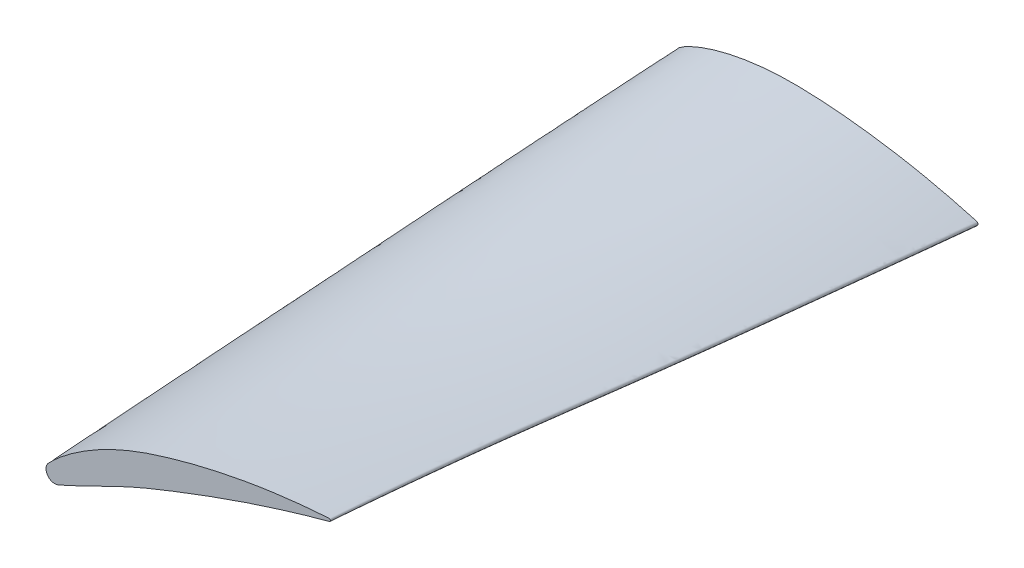
ISO-10303-21;
HEADER;
FILE_DESCRIPTION(('STEP AP214'),'2;1');
FILE_NAME('part.step','',(''),(''),'','','');
FILE_SCHEMA(('AUTOMOTIVE_DESIGN { 1 0 10303 214 1 1 1 1 }'));
ENDSEC;
DATA;
#1=APPLICATION_CONTEXT('core data for automotive mechanical design processes');
#2=APPLICATION_PROTOCOL_DEFINITION('international standard','automotive_design',2000,#1);
#3=PRODUCT_CONTEXT('',#1,'mechanical');
#4=PRODUCT('Part','Part','',(#3));
#5=PRODUCT_RELATED_PRODUCT_CATEGORY('part','',(#4));
#6=PRODUCT_DEFINITION_FORMATION('','',#4);
#7=PRODUCT_DEFINITION_CONTEXT('part definition',#1,'design');
#8=PRODUCT_DEFINITION('design','',#6,#7);
#9=PRODUCT_DEFINITION_SHAPE('','',#8);
#10=(LENGTH_UNIT() NAMED_UNIT(*) SI_UNIT(.MILLI.,.METRE.));
#11=(NAMED_UNIT(*) PLANE_ANGLE_UNIT() SI_UNIT($,.RADIAN.));
#12=(NAMED_UNIT(*) SI_UNIT($,.STERADIAN.) SOLID_ANGLE_UNIT());
#13=UNCERTAINTY_MEASURE_WITH_UNIT(LENGTH_MEASURE(1.E-05),#10,'distance_accuracy_value','');
#14=(GEOMETRIC_REPRESENTATION_CONTEXT(3) GLOBAL_UNCERTAINTY_ASSIGNED_CONTEXT((#13)) GLOBAL_UNIT_ASSIGNED_CONTEXT((#10,
#11,#12)) REPRESENTATION_CONTEXT('',''));
#15=CARTESIAN_POINT('',(0.,0.,0.));
#16=DIRECTION('',(0.,0.,1.));
#17=DIRECTION('',(1.,0.,0.));
#18=AXIS2_PLACEMENT_3D('',#15,#16,#17);
#19=CARTESIAN_POINT('',(2.67974302674886,5.16757042927665,95.));
#20=DIRECTION('',(0.,0.,1.));
#21=DIRECTION('',(1.,0.,0.));
#22=AXIS2_PLACEMENT_3D('',#19,#20,#21);
#23=PLANE('',#22);
#24=CARTESIAN_POINT('',(22.5,8.3545,95.));
#25=CARTESIAN_POINT('',(21.9998910537405,8.32646422091768,95.));
#26=CARTESIAN_POINT('',(20.999130488149,8.270362240857,95.));
#27=CARTESIAN_POINT('',(19.4990081601096,8.15554782897446,95.));
#28=CARTESIAN_POINT('',(17.9987661832434,8.0183344998706,95.));
#29=CARTESIAN_POINT('',(16.4986236684214,7.85558193258976,95.));
#30=CARTESIAN_POINT('',(14.9984119797144,7.66916682703259,95.));
#31=CARTESIAN_POINT('',(13.498190471804,7.45828558436737,95.));
#32=CARTESIAN_POINT('',(11.9980027163715,7.22247727465863,95.));
#33=CARTESIAN_POINT('',(10.4977269369745,6.96200623409512,95.));
#34=CARTESIAN_POINT('',(8.99750215767497,6.67561868892291,95.));
#35=CARTESIAN_POINT('',(7.49719657147457,6.3633096370717,95.));
#36=CARTESIAN_POINT('',(5.99690176267957,6.02388832947706,95.));
#37=CARTESIAN_POINT('',(4.49651709797332,5.65673460090896,95.));
#38=CARTESIAN_POINT('',(2.99595706221561,5.26060822028304,95.));
#39=CARTESIAN_POINT('',(1.49594164345716,4.83211145064321,95.));
#40=CARTESIAN_POINT('',(-0.00572011476587671,4.37486403352637,95.));
#41=CARTESIAN_POINT('',(-1.50888113522643,3.87822227691825,95.));
#42=CARTESIAN_POINT('',(-3.01198812463318,3.32376189130844,95.));
#43=CARTESIAN_POINT('',(-4.51395154890673,2.69785633223587,95.));
#44=CARTESIAN_POINT('',(-6.0166181152778,1.99646093649913,95.));
#45=CARTESIAN_POINT('',(-7.52068720759517,1.21100287341239,95.));
#46=CARTESIAN_POINT('',(-9.02618059601574,0.326922718151535,95.));
#47=CARTESIAN_POINT('',(-10.5357135192512,-0.675833315913514,95.));
#48=CARTESIAN_POINT('',(-12.0609684735525,-1.83797310957665,95.));
#49=CARTESIAN_POINT('',(-13.2154943045,-2.90381284763871,95.));
#50=CARTESIAN_POINT('',(-14.0518212492105,-3.82963926807012,95.));
#51=CARTESIAN_POINT('',(-14.3418764715046,-4.30989093144424,95.));
#52=CARTESIAN_POINT('',(-14.5,-4.5717,95.));
#53=B_SPLINE_CURVE_WITH_KNOTS('',3,(#24,#25,#26,#27,#28,#29,#30,#31,#32,#33,#34,#35,#36,#37,#38,
#39,#40,#41,#42,#43,#44,#45,#46,#47,#48,#49,#50,#51,#52),.UNSPECIFIED.,.F.,.F.,(4,1,1,1,1,1,1,1,
1,1,1,1,1,1,1,1,1,1,1,1,1,1,1,1,1,1,4),(0.,0.0373524191076769,0.0747453696879353,
0.112188700789301,0.149693143831883,0.187266790153044,0.224920082877432,0.262664144311885,
0.300509225446054,0.338468875443711,0.37655549328116,0.414784601631306,0.45317213260481,
0.491739334149282,0.530511985498327,0.569500798450189,0.608792497360596,0.6485511973063,
0.688944959121158,0.730099134796514,0.772178434546485,0.815435666222389,0.860233359781671,
0.907254878740281,0.958270488197437,0.977251167565859,1.),.UNSPECIFIED.);
#54=CARTESIAN_POINT('',(21.4437982363256,8.29350629594942,95.));
#55=VERTEX_POINT('',#54);
#56=CARTESIAN_POINT('',(-13.5254912466661,-3.25503024130048,95.));
#57=VERTEX_POINT('',#56);
#58=EDGE_CURVE('E422',#55,#57,#53,.T.);
#59=ORIENTED_EDGE('',*,*,#58,.T.);
#60=CARTESIAN_POINT('',(-12.7434742201004,-3.99335408297021,95.));
#61=DIRECTION('',(0.,0.,1.));
#62=DIRECTION('',(1.,0.,0.));
#63=AXIS2_PLACEMENT_3D('',#60,#61,#62);
#64=CIRCLE('',#63,1.07548720355782);
#65=CARTESIAN_POINT('',(-12.3520510681681,-4.9950829091243,95.));
#66=VERTEX_POINT('',#65);
#67=EDGE_CURVE('E12',#57,#66,#64,.T.);
#68=ORIENTED_EDGE('',*,*,#67,.T.);
#69=CARTESIAN_POINT('',(-14.5,-5.3663,95.));
#70=CARTESIAN_POINT('',(-14.3338574786962,-5.41795888899334,95.));
#71=CARTESIAN_POINT('',(-14.0027751772282,-5.52090269726699,95.));
#72=CARTESIAN_POINT('',(-13.1384464724626,-5.29548973211239,95.));
#73=CARTESIAN_POINT('',(-11.9775834590507,-4.86816075750501,95.));
#74=CARTESIAN_POINT('',(-10.491070639465,-4.17353189722178,95.));
#75=CARTESIAN_POINT('',(-8.99810442129825,-3.44723424757884,95.));
#76=CARTESIAN_POINT('',(-7.50136288391978,-2.70793065024545,95.));
#77=CARTESIAN_POINT('',(-6.00385974116186,-1.97627561003297,95.));
#78=CARTESIAN_POINT('',(-4.50500207614678,-1.26425555628899,95.));
#79=CARTESIAN_POINT('',(-3.00579237944905,-0.578319843321312,95.));
#80=CARTESIAN_POINT('',(-1.50624066605586,0.0767551393055491,95.));
#81=CARTESIAN_POINT('',(-0.00473399422233682,0.696614608098416,95.));
#82=CARTESIAN_POINT('',(1.49828720735885,1.28811883508212,95.));
#83=CARTESIAN_POINT('',(2.99852083773237,1.87079703170462,95.));
#84=CARTESIAN_POINT('',(4.49782698096358,2.4449130011329,95.));
#85=CARTESIAN_POINT('',(5.99797714686234,3.0053402988244,95.));
#86=CARTESIAN_POINT('',(7.49773977910167,3.55369703945163,95.));
#87=CARTESIAN_POINT('',(8.99777222025143,4.08767655316483,95.));
#88=CARTESIAN_POINT('',(10.4977508489635,4.60748278634374,95.));
#89=CARTESIAN_POINT('',(11.9977487040245,5.1125885757412,95.));
#90=CARTESIAN_POINT('',(13.4978687067357,5.6025230733952,95.));
#91=CARTESIAN_POINT('',(14.9978787489263,6.07796854809305,95.));
#92=CARTESIAN_POINT('',(16.4980684344969,6.53828847968058,95.));
#93=CARTESIAN_POINT('',(17.9980640121018,6.98491486935221,95.));
#94=CARTESIAN_POINT('',(19.498368260577,7.41674062134762,95.));
#95=CARTESIAN_POINT('',(20.9981698011818,7.83699867353189,95.));
#96=CARTESIAN_POINT('',(21.9997629272355,8.10643322866699,95.));
#97=CARTESIAN_POINT('',(22.5,8.241,95.));
#98=B_SPLINE_CURVE_WITH_KNOTS('',3,(#69,#70,#71,#72,#73,#74,#75,#76,#77,#78,#79,#80,#81,#82,#83,
#84,#85,#86,#87,#88,#89,#90,#91,#92,#93,#94,#95,#96,#97),.UNSPECIFIED.,.F.,.F.,(4,1,1,1,1,1,1,1,
1,1,1,1,1,1,1,1,1,1,1,1,1,1,1,1,1,1,4),(0.,0.0129178691475322,0.0257422230857347,
0.0659590516699894,0.107567463116994,0.1496777825886,0.191910011124486,0.234065596462901,
0.276009906969795,0.317675876944146,0.359021471151774,0.400031179614203,0.440789730728685,
0.481444066011761,0.522015741020234,0.562473956721413,0.602820945801867,0.64304793223866,
0.683155194296843,0.723142411985329,0.76301032930095,0.80276449005873,0.842407305718546,
0.881947040208304,0.921386641849836,0.960737234373634,1.),.UNSPECIFIED.);
#99=CARTESIAN_POINT('',(21.4969717228655,7.97034553586951,95.));
#100=VERTEX_POINT('',#99);
#101=EDGE_CURVE('E377',#66,#100,#98,.T.);
#102=ORIENTED_EDGE('',*,*,#101,.T.);
#103=CARTESIAN_POINT('',(21.4538415329805,8.12920382571606,95.));
#104=DIRECTION('',(0.,0.,1.));
#105=DIRECTION('',(1.,0.,0.));
#106=AXIS2_PLACEMENT_3D('',#103,#104,#105);
#107=CIRCLE('',#106,0.164609141703862);
#108=EDGE_CURVE('E385',#100,#55,#107,.T.);
#109=ORIENTED_EDGE('',*,*,#108,.T.);
#110=EDGE_LOOP('',(#59,#68,#102,#109));
#111=FACE_BOUND('',#110,.T.);
#112=ADVANCED_FACE('F367',(#111),#23,.T.);
#113=CARTESIAN_POINT('',(3.62978989841767,3.98709877284983,15.));
#114=DIRECTION('',(0.,0.,1.));
#115=DIRECTION('',(1.,0.,0.));
#116=AXIS2_PLACEMENT_3D('',#113,#114,#115);
#117=PLANE('',#116);
#118=CARTESIAN_POINT('',(22.5,0.6019,15.));
#119=CARTESIAN_POINT('',(22.0004801456367,0.743448303988534,15.));
#120=CARTESIAN_POINT('',(21.0036778439819,1.02591090077752,15.));
#121=CARTESIAN_POINT('',(19.5031070791856,1.41743163496818,15.));
#122=CARTESIAN_POINT('',(18.0028469043127,1.78357456609442,15.));
#123=CARTESIAN_POINT('',(16.502683492419,2.1242210000881,15.));
#124=CARTESIAN_POINT('',(15.0024571566949,2.43903578424933,15.));
#125=CARTESIAN_POINT('',(13.5022446751898,2.72846183176391,15.));
#126=CARTESIAN_POINT('',(12.0020824550853,2.99281983078089,15.));
#127=CARTESIAN_POINT('',(10.5018830303946,3.2315680053102,15.));
#128=CARTESIAN_POINT('',(9.00169985602485,3.44480167247068,15.));
#129=CARTESIAN_POINT('',(7.5014973849583,3.63206435172592,15.));
#130=CARTESIAN_POINT('',(6.00132923056707,3.79329134843236,15.));
#131=CARTESIAN_POINT('',(4.5011283868435,3.92738621319498,15.));
#132=CARTESIAN_POINT('',(3.00080963350611,4.03223085442607,15.));
#133=CARTESIAN_POINT('',(1.50072006262031,4.11197512012673,15.));
#134=CARTESIAN_POINT('',(0.000351996618334273,4.1580952924409,15.));
#135=CARTESIAN_POINT('',(-1.5005704397692,4.1562070771378,15.));
#136=CARTESIAN_POINT('',(-3.00170085474345,4.09717713516797,15.));
#137=CARTESIAN_POINT('',(-4.50290632570798,3.98005111219581,15.));
#138=CARTESIAN_POINT('',(-6.00445491552995,3.80324179379597,15.));
#139=CARTESIAN_POINT('',(-7.50635095907841,3.56115662490657,15.));
#140=CARTESIAN_POINT('',(-9.0089529543257,3.24789010701522,15.));
#141=CARTESIAN_POINT('',(-10.5128422641679,2.8544400857911,15.));
#142=CARTESIAN_POINT('',(-12.0219989344386,2.36559875558435,15.));
#143=CARTESIAN_POINT('',(-13.3590081711848,1.81241244827062,15.));
#144=CARTESIAN_POINT('',(-14.3660550330646,1.29978244531268,15.));
#145=CARTESIAN_POINT('',(-14.8354957932181,0.952275454415264,15.));
#146=CARTESIAN_POINT('',(-15.,0.8305,15.));
#147=B_SPLINE_CURVE_WITH_KNOTS('',3,(#118,#119,#120,#121,#122,#123,#124,#125,#126,#127,#128,
#129,#130,#131,#132,#133,#134,#135,#136,#137,#138,#139,#140,#141,#142,#143,#144,#145,#146),
.UNSPECIFIED.,.F.,.F.,(4,1,1,1,1,1,1,1,1,1,1,1,1,1,1,1,1,1,1,1,1,1,1,1,1,1,4),(0.,
0.0405471254789482,0.0809126357037819,0.121107731438113,0.161150660333943,0.201050818138964,
0.240820428376457,0.28047099292219,0.320011810686722,0.359453384553901,0.39880578400949,
0.438079549375136,0.477283837516492,0.516429778741187,0.555532420171843,0.594598464136121,
0.633648040285841,0.672727813790417,0.711896303230933,0.751217923346752,0.79077440845747,
0.830669227424733,0.871043983569076,0.912135495950324,0.95443208923738,0.984031823286368,1.),.UNSPECIFIED.);
#148=CARTESIAN_POINT('',(22.1381279609557,0.704363628649345,15.));
#149=VERTEX_POINT('',#148);
#150=CARTESIAN_POINT('',(-14.8942891205797,0.908607786426924,15.));
#151=VERTEX_POINT('',#150);
#152=EDGE_CURVE('E418',#149,#151,#147,.T.);
#153=ORIENTED_EDGE('',*,*,#152,.F.);
#154=CARTESIAN_POINT('',(22.0692255715257,0.460641662364324,15.));
#155=DIRECTION('',(0.,0.,1.));
#156=DIRECTION('',(1.,0.,0.));
#157=AXIS2_PLACEMENT_3D('',#154,#155,#156);
#158=CIRCLE('',#157,0.253274428474345);
#159=CARTESIAN_POINT('',(22.0494369692504,0.208141469613885,15.));
#160=VERTEX_POINT('',#159);
#161=EDGE_CURVE('E427',#160,#149,#158,.T.);
#162=ORIENTED_EDGE('',*,*,#161,.F.);
#163=CARTESIAN_POINT('',(-15.,-0.3621,15.));
#164=CARTESIAN_POINT('',(-14.8337508207636,-0.393943646758233,15.));
#165=CARTESIAN_POINT('',(-14.3395046776833,-0.488612382352353,15.));
#166=CARTESIAN_POINT('',(-13.3306146046433,-0.482970602993115,15.));
#167=CARTESIAN_POINT('',(-11.9982574373501,-0.402153404264455,15.));
#168=CARTESIAN_POINT('',(-10.4989812491944,-0.253641579970841,15.));
#169=CARTESIAN_POINT('',(-8.99993992713442,-0.0916777414412627,15.));
#170=CARTESIAN_POINT('',(-7.50041569471058,0.0720436308548387,15.));
#171=CARTESIAN_POINT('',(-6.00077731930807,0.227451569292098,15.));
#172=CARTESIAN_POINT('',(-4.50086227982774,0.366520992101925,15.));
#173=CARTESIAN_POINT('',(-3.00083820970837,0.485229637823891,15.));
#174=CARTESIAN_POINT('',(-1.50074071339361,0.5806061435549,15.));
#175=CARTESIAN_POINT('',(-0.000420320411103459,0.647514870629046,15.));
#176=CARTESIAN_POINT('',(1.49986119199421,0.69023773598975,15.));
#177=CARTESIAN_POINT('',(2.99994511525098,0.722507590333595,15.));
#178=CARTESIAN_POINT('',(4.49991994628112,0.751122942877969,15.));
#179=CARTESIAN_POINT('',(5.99995905174513,0.768194252241531,15.));
#180=CARTESIAN_POINT('',(7.49999422628617,0.775097896512896,15.));
#181=CARTESIAN_POINT('',(9.00003961377874,0.77121394045976,15.));
#182=CARTESIAN_POINT('',(10.5000906094785,0.755244474654114,15.));
#183=CARTESIAN_POINT('',(12.0001450690742,0.726999810384712,15.));
#184=CARTESIAN_POINT('',(13.5002018621916,0.686135869309666,15.));
#185=CARTESIAN_POINT('',(15.0002558604675,0.632418301246246,15.));
#186=CARTESIAN_POINT('',(16.5003107312283,0.565929073149755,15.));
#187=CARTESIAN_POINT('',(18.0003568748256,0.486574914875036,15.));
#188=CARTESIAN_POINT('',(19.500395625021,0.394649183906419,15.));
#189=CARTESIAN_POINT('',(21.0004618408754,0.290871536804795,15.));
#190=CARTESIAN_POINT('',(22.0000599731914,0.212097917898061,15.));
#191=CARTESIAN_POINT('',(22.5,0.1727,15.));
#192=B_SPLINE_CURVE_WITH_KNOTS('',3,(#163,#164,#165,#166,#167,#168,#169,#170,#171,#172,#173,
#174,#175,#176,#177,#178,#179,#180,#181,#182,#183,#184,#185,#186,#187,#188,#189,#190,#191),
.UNSPECIFIED.,.F.,.F.,(4,1,1,1,1,1,1,1,1,1,1,1,1,1,1,1,1,1,1,1,1,1,1,1,1,1,4),(0.,
0.0134954373509958,0.0401209070056691,0.0801035486492581,0.120200271304862,0.16034725758551,
0.200499927756748,0.24063028112407,0.280720088692774,0.320764082479849,0.360763470164871,
0.400724233111019,0.440662437593029,0.480592577096106,0.520519432551702,0.560442331926646,
0.600362986539359,0.640283380075503,0.680205895441389,0.720133244049067,0.760068325478222,
0.800014143389996,0.839973599056,0.87994959077855,0.919944524759835,0.959960973171278,1.),.UNSPECIFIED.);
#193=CARTESIAN_POINT('',(-14.5512445057347,-0.439895047780484,15.));
#194=VERTEX_POINT('',#193);
#195=EDGE_CURVE('E414',#194,#160,#192,.T.);
#196=ORIENTED_EDGE('',*,*,#195,.F.);
#197=CARTESIAN_POINT('',(-14.4491824315936,0.303953292978351,15.));
#198=DIRECTION('',(0.,0.,1.));
#199=DIRECTION('',(1.,0.,0.));
#200=AXIS2_PLACEMENT_3D('',#197,#198,#199);
#201=CIRCLE('',#200,0.75081756840637);
#202=EDGE_CURVE('E409',#151,#194,#201,.T.);
#203=ORIENTED_EDGE('',*,*,#202,.F.);
#204=EDGE_LOOP('',(#153,#162,#196,#203));
#205=FACE_BOUND('',#204,.T.);
#206=ADVANCED_FACE('F426',(#205),#117,.F.);
#207=CARTESIAN_POINT('',(22.0494404976664,0.208141193089683,15.));
#208=CARTESIAN_POINT('',(22.0582866363414,0.850647241987668,21.6667130616123));
#209=CARTESIAN_POINT('',(21.991884870213,2.12543650985814,35.0007434225206));
#210=CARTESIAN_POINT('',(21.8644874400544,4.06602125450472,55.0001044384297));
#211=CARTESIAN_POINT('',(21.0357723984727,5.8572204434323,75.0024586339581));
#212=CARTESIAN_POINT('',(21.2806234919206,7.24962562251817,88.3357467367558));
#213=CARTESIAN_POINT('',(21.4969722952819,7.97034569128105,95.));
#214=CARTESIAN_POINT('',(22.1067664830093,0.203648518800481,15.));
#215=CARTESIAN_POINT('',(22.1152944108341,0.847954628957077,21.6667131877604));
#216=CARTESIAN_POINT('',(22.0493877427049,2.12580606076304,35.0007458059728));
#217=CARTESIAN_POINT('',(21.9226096709191,4.07164281366722,55.000095906462));
#218=CARTESIAN_POINT('',(21.0894622772977,5.86730870637476,75.0024903829149));
#219=CARTESIAN_POINT('',(21.3428606821937,7.26401672563023,88.3356783248226));
#220=CARTESIAN_POINT('',(21.5515457165178,7.98516243155231,95.));
#221=CARTESIAN_POINT('',(22.2319202599483,0.23507235936657,15.));
#222=CARTESIAN_POINT('',(22.2397010247678,0.883009450060241,21.6667135673205));
#223=CARTESIAN_POINT('',(22.1714738699357,2.16877827757869,35.0007510559382));
#224=CARTESIAN_POINT('',(22.0324854520906,4.12507259748508,55.0000769607619));
#225=CARTESIAN_POINT('',(21.2198791911234,5.93204866589843,75.0025609258355));
#226=CARTESIAN_POINT('',(21.4186314164471,7.3272728597572,88.3355263128924));
#227=CARTESIAN_POINT('',(21.6102234321042,8.04903077542687,94.9999999999999));
#228=CARTESIAN_POINT('',(22.3452513740805,0.411246784142851,15.));
#229=CARTESIAN_POINT('',(22.346445029516,1.06122243783503,21.6667229485645));
#230=CARTESIAN_POINT('',(22.2671562759854,2.35329585063643,35.0008159790929));
#231=CARTESIAN_POINT('',(22.1044122146306,4.30085626104823,54.9998356385636));
#232=CARTESIAN_POINT('',(21.2920355312845,6.15878380547208,75.0034614202868));
#233=CARTESIAN_POINT('',(21.4618944526805,7.48449260388448,88.3335855011119));
#234=CARTESIAN_POINT('',(21.6278486950899,8.15692891271709,95.0000000000003));
#235=CARTESIAN_POINT('',(22.3075783414544,0.581731564695672,15.));
#236=CARTESIAN_POINT('',(22.3046171809833,1.22920023047166,21.6667371608309));
#237=CARTESIAN_POINT('',(22.2152799163903,2.51830137112167,35.0008517973005));
#238=CARTESIAN_POINT('',(22.0476498750245,4.44879594870293,54.9996889439129));
#239=CARTESIAN_POINT('',(21.1971579859338,6.3324338332453,75.0040124596458));
#240=CARTESIAN_POINT('',(21.3965666388205,7.6043483719843,88.3323972084865));
#241=CARTESIAN_POINT('',(21.5853386487059,8.24057301974568,94.9999999999997));
#242=CARTESIAN_POINT('',(22.220127870911,0.670491501451702,15.));
#243=CARTESIAN_POINT('',(22.2151651988162,1.31524331346643,21.6667404716698));
#244=CARTESIAN_POINT('',(22.120896679827,2.59901053724843,35.0008544126878));
#245=CARTESIAN_POINT('',(21.9531549586708,4.5197165124232,54.999674822411));
#246=CARTESIAN_POINT('',(21.0781431793569,6.39836220215481,75.004066338018));
#247=CARTESIAN_POINT('',(21.3067423389882,7.65631896906259,88.3322808742078));
#248=CARTESIAN_POINT('',(21.5185172370309,8.28478260117664,95.0000000000002));
#249=CARTESIAN_POINT('',(22.1658086052636,0.696538061824769,15.));
#250=CARTESIAN_POINT('',(22.1603451299197,1.33975102972681,21.6667394951691));
#251=CARTESIAN_POINT('',(22.0645060201149,2.62028323366584,35.0008527959534));
#252=CARTESIAN_POINT('',(21.8972755702486,4.53675366552512,54.9996819463677));
#253=CARTESIAN_POINT('',(21.0143804597935,6.40807478745568,75.0040394550685));
#254=CARTESIAN_POINT('',(21.2561022109959,7.66700015358144,88.3323388679255));
#255=CARTESIAN_POINT('',(21.472128778144,8.29523805345418,95.));
#256=CARTESIAN_POINT('',(21.7588609705496,0.811585814114416,15.));
#257=CARTESIAN_POINT('',(21.749787274634,1.44340042243735,21.6667339984034));
#258=CARTESIAN_POINT('',(21.6507374940897,2.7005975094846,35.0008415553704));
#259=CARTESIAN_POINT('',(21.4733677950757,4.57939315759649,54.999729537703));
#260=CARTESIAN_POINT('',(20.6026589447909,6.4177733368085,75.0038603046241));
#261=CARTESIAN_POINT('',(20.8114972762672,7.64413744315132,88.3327252655815));
#262=CARTESIAN_POINT('',(21.0556203704641,8.26977819584121,95.));
#263=CARTESIAN_POINT('',(20.99998276009,1.02464204685874,15.));
#264=CARTESIAN_POINT('',(20.985997441662,1.63300496546631,21.6667666971417));
#265=CARTESIAN_POINT('',(20.8744413695581,2.84358591003959,35.0008370507666));
#266=CARTESIAN_POINT('',(20.6931305069393,4.65762310624479,54.9996962501031));
#267=CARTESIAN_POINT('',(19.797729968813,6.41787782702251,75.0039979798319));
#268=CARTESIAN_POINT('',(20.0635498534191,7.62007821075639,88.3324261311927));
#269=CARTESIAN_POINT('',(20.2794045992863,8.21692674472268,95.));
#270=CARTESIAN_POINT('',(19.4757114867528,1.42603577718938,15.));
#271=CARTESIAN_POINT('',(19.450891148962,1.99028001059355,21.6667702286115));
#272=CARTESIAN_POINT('',(19.3228921562114,3.1113019265042,35.0008171833916));
#273=CARTESIAN_POINT('',(19.1199620385229,4.79156535155135,54.9997604932814));
#274=CARTESIAN_POINT('',(18.2276710389926,6.4078766532892,75.0037608406696));
#275=CARTESIAN_POINT('',(18.4839195036728,7.524861990015,88.3329367689152));
#276=CARTESIAN_POINT('',(18.7277540415791,8.09036204674375,95.));
#277=CARTESIAN_POINT('',(17.5616983078943,1.89214388520309,15.));
#278=CARTESIAN_POINT('',(17.5250162459373,2.40048571029254,21.6667838482034));
#279=CARTESIAN_POINT('',(17.3762327966528,3.40876355460022,35.0008047806882));
#280=CARTESIAN_POINT('',(17.1543517051954,4.92232095642351,54.9997834738317));
#281=CARTESIAN_POINT('',(16.2530692028786,6.35733777854625,75.0036813100312));
#282=CARTESIAN_POINT('',(16.5403390337925,7.3784791680251,88.3331070670032));
#283=CARTESIAN_POINT('',(16.7900698327868,7.89438882200387,95.));
#284=CARTESIAN_POINT('',(15.2522638746945,2.39423926340048,15.));
#285=CARTESIAN_POINT('',(15.202709527517,2.83547967854902,21.6667871718965));
#286=CARTESIAN_POINT('',(15.0333859286286,3.70815894272401,35.0007898862046));
#287=CARTESIAN_POINT('',(14.7908889714105,5.01984871883839,54.9998306222703));
#288=CARTESIAN_POINT('',(13.8928883263064,6.23785741058353,75.0035075859934));
#289=CARTESIAN_POINT('',(14.1999994421638,7.14104371172053,88.3334810946413));
#290=CARTESIAN_POINT('',(14.4691820183852,7.60310843588923,95.));
#291=CARTESIAN_POINT('',(12.931494467255,2.83806802731874,15.));
#292=CARTESIAN_POINT('',(12.870831305404,3.21205266073325,21.6667874822283));
#293=CARTESIAN_POINT('',(12.6841717294472,3.94889612194302,35.0007796037745));
#294=CARTESIAN_POINT('',(12.4261685116296,5.05817156425438,54.9998661479592));
#295=CARTESIAN_POINT('',(11.5362936773489,6.0590807727315,75.0033757468358));
#296=CARTESIAN_POINT('',(11.8690440354816,6.84655447042727,88.3337651144606));
#297=CARTESIAN_POINT('',(12.1543264634488,7.25430245423604,95.));
#298=CARTESIAN_POINT('',(10.6006737299057,3.22259791409775,15.));
#299=CARTESIAN_POINT('',(10.5305260550517,3.52912974931252,21.6667907643181));
#300=CARTESIAN_POINT('',(10.3300036806559,4.12992031481731,35.0007694779759));
#301=CARTESIAN_POINT('',(10.0612359661345,5.03716666642278,54.9998966671402));
#302=CARTESIAN_POINT('',(9.18631409695777,5.82168810302546,75.0032637799664));
#303=CARTESIAN_POINT('',(9.54468870200452,6.49295760423473,88.3340060912419));
#304=CARTESIAN_POINT('',(9.84720219129322,6.84655779793251,95.0000000000002));
#305=CARTESIAN_POINT('',(8.26113170595855,3.54662426241634,15.));
#306=CARTESIAN_POINT('',(8.18325397312775,3.78519982644789,21.6667947323814));
#307=CARTESIAN_POINT('',(7.97245173529495,4.24912455808421,35.0007602093024));
#308=CARTESIAN_POINT('',(7.69774067209243,4.95376612848861,54.9999231570516));
#309=CARTESIAN_POINT('',(6.84459753692919,5.52174002895383,75.0031670752428));
#310=CARTESIAN_POINT('',(7.23001570130228,6.07953813618631,88.3342141333602));
#311=CARTESIAN_POINT('',(7.54957986122407,6.38071964041849,94.9999999999998));
#312=CARTESIAN_POINT('',(5.91419843872572,3.80894241095329,15.));
#313=CARTESIAN_POINT('',(5.83035424302472,3.98000512289586,21.6667934177438));
#314=CARTESIAN_POINT('',(5.61285380410744,4.30783743275117,35.0007556562455));
#315=CARTESIAN_POINT('',(5.33723387968568,4.80937274425011,54.9999410661969));
#316=CARTESIAN_POINT('',(4.51201029058563,5.16260394108879,75.0030999821103));
#317=CARTESIAN_POINT('',(4.92625688667959,5.60598357990584,88.3343587848007));
#318=CARTESIAN_POINT('',(5.263567852419,5.8540928606065,95.0000000000003));
#319=CARTESIAN_POINT('',(3.56097312917984,4.00241527499478,15.));
#320=CARTESIAN_POINT('',(3.47313661242589,4.10550098600435,21.666796463737));
#321=CARTESIAN_POINT('',(3.25300007783742,4.29649962907475,35.0007501706514));
#322=CARTESIAN_POINT('',(2.98197602377676,4.59601518232342,54.9999556976167));
#323=CARTESIAN_POINT('',(2.19239152917551,4.73287731520217,75.0030469344957));
#324=CARTESIAN_POINT('',(2.63637759059805,5.06720124591667,88.3344728399002));
#325=CARTESIAN_POINT('',(2.99127291436706,5.26583958983023,94.9999999999999));
#326=CARTESIAN_POINT('',(1.20369941146299,4.13243931850974,15.));
#327=CARTESIAN_POINT('',(1.11366630106894,4.16773358138594,21.6667986671219));
#328=CARTESIAN_POINT('',(0.894511395400943,4.22243192852126,35.0007477483418));
#329=CARTESIAN_POINT('',(0.633615260933427,4.31840133492709,54.9999608708117));
#330=CARTESIAN_POINT('',(-0.114777294979106,4.24348006876146,75.0030286614508));
#331=CARTESIAN_POINT('',(0.362252420174496,4.46438194332203,88.3345120390435));
#332=CARTESIAN_POINT('',(0.736328078100112,4.61047686357483,95.0000000000001));
#333=CARTESIAN_POINT('',(-1.15701733444814,4.17612051410454,15.));
#334=CARTESIAN_POINT('',(-1.24674454260991,4.14405111157347,21.6668033850322));
#335=CARTESIAN_POINT('',(-1.45977571569856,4.06286665396903,35.0007453211791));
#336=CARTESIAN_POINT('',(-1.70419072068984,3.95879730344111,54.9999622886809));
#337=CARTESIAN_POINT('',(-2.40108487934251,3.66589186377236,75.0030254167503));
#338=CARTESIAN_POINT('',(-1.89231697963262,3.78889836186831,88.3345186664833));
#339=CARTESIAN_POINT('',(-1.50085907331907,3.89295103523359,94.9999999999999));
#340=CARTESIAN_POINT('',(-3.12314925067676,4.0939046802868,15.));
#341=CARTESIAN_POINT('',(-3.20935993400094,4.00650683967494,21.6668121900047));
#342=CARTESIAN_POINT('',(-3.41053768531293,3.81329615100382,35.0007442738963));
#343=CARTESIAN_POINT('',(-3.63182808598271,3.54442747544537,54.9999527451592));
#344=CARTESIAN_POINT('',(-4.27290574284493,3.06793259641389,75.003064643868));
#345=CARTESIAN_POINT('',(-3.73766279102704,3.12177154024406,88.3344334749891));
#346=CARTESIAN_POINT('',(-3.33293806954106,3.19906445537694,95.0000000000001));
#347=CARTESIAN_POINT('',(-4.69080892559359,3.9575069981525,15.));
#348=CARTESIAN_POINT('',(-4.77211818034826,3.82579239372042,21.6668213020886));
#349=CARTESIAN_POINT('',(-4.95964888783002,3.54322167621457,35.0007444081637));
#350=CARTESIAN_POINT('',(-5.15653205552709,3.14346513361809,54.9999386051635));
#351=CARTESIAN_POINT('',(-5.74648103868324,2.52324534334852,75.0031210777955));
#352=CARTESIAN_POINT('',(-5.18759407475602,2.5216706196251,88.3343111882717));
#353=CARTESIAN_POINT('',(-4.77129918728235,2.57727139478177,95.));
#354=CARTESIAN_POINT('',(-5.86269177828479,3.81836355992253,15.));
#355=CARTESIAN_POINT('',(-5.93942068718662,3.65383776295592,21.6668315690366));
#356=CARTESIAN_POINT('',(-6.11482191625845,3.30501502063278,35.0007437998834));
#357=CARTESIAN_POINT('',(-6.29020958583683,2.80725973730049,54.9999253317476));
#358=CARTESIAN_POINT('',(-6.83854999624041,2.08061462044675,75.0031747875805));
#359=CARTESIAN_POINT('',(-6.26081370372698,2.03830029110943,88.3341946817444));
#360=CARTESIAN_POINT('',(-5.83545418796166,2.07809140186302,95.));
#361=CARTESIAN_POINT('',(-7.02947375301621,3.64084227597415,15.));
#362=CARTESIAN_POINT('',(-7.10044401496566,3.44364793736837,21.6668434817259));
#363=CARTESIAN_POINT('',(-7.26135484247145,3.02890590220741,35.0007438336574));
#364=CARTESIAN_POINT('',(-7.41243867759354,2.4346256102869,54.9999073420149));
#365=CARTESIAN_POINT('',(-7.91485730094754,1.6015007388005,75.0032467232103));
#366=CARTESIAN_POINT('',(-7.31814430215343,1.52098882044269,88.334038781466));
#367=CARTESIAN_POINT('',(-6.88402855300583,1.54658291235446,95.0000000000001));
#368=CARTESIAN_POINT('',(-8.18933750365691,3.42295819400218,15.));
#369=CARTESIAN_POINT('',(-8.2534933011094,3.19328740972352,21.6668580421233));
#370=CARTESIAN_POINT('',(-8.39775219670224,2.71314393887365,35.0007437275454));
#371=CARTESIAN_POINT('',(-8.52075853792832,2.02244183550664,54.9998858698076));
#372=CARTESIAN_POINT('',(-8.97409463330898,1.08548309512478,75.0033327306774));
#373=CARTESIAN_POINT('',(-8.35760984745137,0.968508307517692,88.3338523600033));
#374=CARTESIAN_POINT('',(-7.91459177127724,0.980904195645129,95.0000000000002));
#375=CARTESIAN_POINT('',(-9.34046568407597,3.16272636170146,15.));
#376=CARTESIAN_POINT('',(-9.39663049513414,2.90121698831831,21.6668745827066));
#377=CARTESIAN_POINT('',(-9.52186022960555,2.35684091064034,35.0007440552156));
#378=CARTESIAN_POINT('',(-9.61421426827572,1.57242689996447,54.9998599085555));
#379=CARTESIAN_POINT('',(-10.0136953128537,0.531461114139959,75.0034362630786));
#380=CARTESIAN_POINT('',(-9.37671485157947,0.379303817824594,88.3336280291364));
#381=CARTESIAN_POINT('',(-8.92471333163825,0.379213521124035,95.0000000000001));
#382=CARTESIAN_POINT('',(-10.4804146046307,2.85714017634391,15.));
#383=CARTESIAN_POINT('',(-10.5276556616092,2.5646649457258,21.6669095659339));
#384=CARTESIAN_POINT('',(-10.6317592147206,1.95752497312959,35.0007372225804));
#385=CARTESIAN_POINT('',(-10.6886799393766,1.07816872648638,54.9998313424784));
#386=CARTESIAN_POINT('',(-11.0307041266216,-0.0636935274560477,75.0035573778969));
#387=CARTESIAN_POINT('',(-10.3729018001115,-0.248246441590662,88.3333643977805));
#388=CARTESIAN_POINT('',(-9.91217502422241,-0.259091062748467,95.));
#389=CARTESIAN_POINT('',(-11.4186058215042,2.56179718668215,15.0000000000001));
#390=CARTESIAN_POINT('',(-11.4560909759247,2.24102418890568,21.6668917802355));
#391=CARTESIAN_POINT('',(-11.5383910256002,1.57817357754949,35.0007566579398));
#392=CARTESIAN_POINT('',(-11.5633232014974,0.624309970626326,54.9997899957807));
#393=CARTESIAN_POINT('',(-11.8513153721064,-0.6021957603467,75.0037033498952));
#394=CARTESIAN_POINT('',(-11.1796019579261,-0.806718850633671,88.3330512743735));
#395=CARTESIAN_POINT('',(-10.7143280366731,-0.822024766718104,95.));
#396=CARTESIAN_POINT('',(-12.1588020707825,2.29517867890697,15.));
#397=CARTESIAN_POINT('',(-12.1897858323202,1.95731274015245,21.6669557026937));
#398=CARTESIAN_POINT('',(-12.2563828712871,1.25831682882759,35.0007351067071));
#399=CARTESIAN_POINT('',(-12.2543637734277,0.244858388198114,54.9997695338539));
#400=CARTESIAN_POINT('',(-12.4978542017738,-1.04822569768702,75.003806764654));
#401=CARTESIAN_POINT('',(-11.8112399915729,-1.27242789604267,88.3328235496127));
#402=CARTESIAN_POINT('',(-11.3400531488356,-1.29394956164629,95.));
#403=CARTESIAN_POINT('',(-12.707763945052,2.07892606058967,15.));
#404=CARTESIAN_POINT('',(-12.733685471723,1.72886789745751,21.6670177480464));
#405=CARTESIAN_POINT('',(-12.7878981860397,1.00372073576095,35.0007134556319));
#406=CARTESIAN_POINT('',(-12.7643721272374,-0.0541688919055263,54.9997522374512));
#407=CARTESIAN_POINT('',(-12.9720195260572,-1.39736991705637,75.0038976153334));
#408=CARTESIAN_POINT('',(-12.2753703683084,-1.63465802818529,88.3326230382979));
#409=CARTESIAN_POINT('',(-11.8004587693143,-1.65942454904542,95.));
#410=CARTESIAN_POINT('',(-13.2496726600265,1.8452904787026,15.));
#411=CARTESIAN_POINT('',(-13.2694090858235,1.48152518952192,21.6670624425771));
#412=CARTESIAN_POINT('',(-13.3091219711565,0.727860558701153,35.000702853969));
#413=CARTESIAN_POINT('',(-13.2620820868962,-0.373771971288034,54.9997222949999));
#414=CARTESIAN_POINT('',(-13.4300386324816,-1.76857521148894,75.0040280061619));
#415=CARTESIAN_POINT('',(-12.7263947666437,-2.0123913308503,88.3323386744869));
#416=CARTESIAN_POINT('',(-12.2510866114057,-2.03717340297425,95.));
#417=CARTESIAN_POINT('',(-13.7839023990361,1.59503279012903,15.));
#418=CARTESIAN_POINT('',(-13.7922093700222,1.20846589597727,21.6669339845615));
#419=CARTESIAN_POINT('',(-13.8094111463635,0.414136441639565,35.0007725623098));
#420=CARTESIAN_POINT('',(-13.7351099391166,-0.729265104435362,54.9996710109621));
#421=CARTESIAN_POINT('',(-13.8678920365641,-2.16050198993159,75.0041634512264));
#422=CARTESIAN_POINT('',(-13.1647459627272,-2.40835430517301,88.332056750371));
#423=CARTESIAN_POINT('',(-12.6903258072074,-2.42803250777092,95.));
#424=CARTESIAN_POINT('',(-14.3061508398773,1.3192647558173,15.));
#425=CARTESIAN_POINT('',(-14.3000705348933,0.909032287647207,21.6667626035974));
#426=CARTESIAN_POINT('',(-14.290803831415,0.0721652750770779,35.0008672778793));
#427=CARTESIAN_POINT('',(-14.1844671886259,-1.11130141004226,54.9995965883053));
#428=CARTESIAN_POINT('',(-14.2832529614596,-2.58317986850783,75.00436645249));
#429=CARTESIAN_POINT('',(-13.5779702290277,-2.81518813284153,88.3316325824633));
#430=CARTESIAN_POINT('',(-13.1165654888171,-2.8328382477735,95.));
#431=CARTESIAN_POINT('',(-14.6325578980614,1.09887149244503,15.));
#432=CARTESIAN_POINT('',(-14.6249454328594,0.685500635206219,21.6669211224905));
#433=CARTESIAN_POINT('',(-14.6074059312771,-0.159215201180928,35.0007992593233));
#434=CARTESIAN_POINT('',(-14.4737470025398,-1.38324257437983,54.9995968600698));
#435=CARTESIAN_POINT('',(-14.5465466727362,-2.86101301139242,75.0044333961412));
#436=CARTESIAN_POINT('',(-13.8622889227517,-3.11507237259603,88.3314761518386));
#437=CARTESIAN_POINT('',(-13.3909850218272,-3.11256408747125,95.));
#438=CARTESIAN_POINT('',(-14.8018081653058,0.976265981404689,15.));
#439=CARTESIAN_POINT('',(-14.7945246486889,0.563875387207505,21.6670653603043));
#440=CARTESIAN_POINT('',(-14.7769008342055,-0.282525875327049,35.0007357925307));
#441=CARTESIAN_POINT('',(-14.6229805761347,-1.52747119731935,54.9996026240396));
#442=CARTESIAN_POINT('',(-14.6957364001136,-3.01642269570052,75.0044738151846));
#443=CARTESIAN_POINT('',(-13.9953529924417,-3.25507298959878,88.3313779670517));
#444=CARTESIAN_POINT('',(-13.5339195705763,-3.26395734405835,95.));
#445=CARTESIAN_POINT('',(-14.8197037300226,0.963260000846212,15.));
#446=CARTESIAN_POINT('',(-14.8124674531771,0.551004576090223,21.6670828138778));
#447=CARTESIAN_POINT('',(-14.7944672528355,-0.295220675367323,35.0007281058968));
#448=CARTESIAN_POINT('',(-14.6396277250481,-1.54369996597238,54.9996033453166));
#449=CARTESIAN_POINT('',(-14.7090214079589,-3.02997078866525,75.0044786176815));
#450=CARTESIAN_POINT('',(-14.0126428202036,-3.2738805641096,88.3313662766717));
#451=CARTESIAN_POINT('',(-13.5524852398145,-3.28427179908474,95.));
#452=CARTESIAN_POINT('',(-14.8444171949169,0.945219846486766,15.));
#453=CARTESIAN_POINT('',(-14.8372188309605,0.533189833812828,21.6671074880022));
#454=CARTESIAN_POINT('',(-14.8186061921021,-0.312533716738511,35.000718652173));
#455=CARTESIAN_POINT('',(-14.6633130878695,-1.56711588035958,54.9995994195504));
#456=CARTESIAN_POINT('',(-14.7249505236104,-3.04531779016052,75.0045037784683));
#457=CARTESIAN_POINT('',(-14.0411627604246,-3.30648080443681,88.331310169113));
#458=CARTESIAN_POINT('',(-13.5902971960546,-3.32899082499851,95.));
#459=CARTESIAN_POINT('',(-14.8686149833256,0.927489116115912,15.));
#460=CARTESIAN_POINT('',(-14.8615202419193,0.515650807243041,21.6671306631303));
#461=CARTESIAN_POINT('',(-14.8423174178476,-0.329327442004969,35.000709122911));
#462=CARTESIAN_POINT('',(-14.6868653816449,-1.59111407329366,54.9995980069944));
#463=CARTESIAN_POINT('',(-14.7387704354693,-3.05616380007345,75.0045189605014));
#464=CARTESIAN_POINT('',(-14.0736652689116,-3.34813685645026,88.3312756758855));
#465=CARTESIAN_POINT('',(-13.6364813960461,-3.39246058731203,95.0000000000001));
#466=CARTESIAN_POINT('',(-14.8853824346868,0.915164300122837,15.));
#467=CARTESIAN_POINT('',(-14.878573222897,0.503329370730769,21.6671425484338));
#468=CARTESIAN_POINT('',(-14.8591891063792,-0.341333322517253,35.0007026713704));
#469=CARTESIAN_POINT('',(-14.7022744301187,-1.60699327178797,54.9996027586794));
#470=CARTESIAN_POINT('',(-14.7509442780565,-3.06585808953082,75.0045064037021));
#471=CARTESIAN_POINT('',(-14.0922858472927,-3.37401875401905,88.3313018142469));
#472=CARTESIAN_POINT('',(-13.6575667379281,-3.42644029538152,95.));
#473=CARTESIAN_POINT('',(-15.0133524979226,0.820961194459388,15.));
#474=CARTESIAN_POINT('',(-15.0086564693723,0.408927584122529,21.6672196584802));
#475=CARTESIAN_POINT('',(-14.993288387006,-0.43793994988639,35.0006592076429));
#476=CARTESIAN_POINT('',(-14.8106567470692,-1.71761642083657,54.9996392122079));
#477=CARTESIAN_POINT('',(-14.8692104325111,-3.17178085430676,75.0044040399495));
#478=CARTESIAN_POINT('',(-14.2010544826311,-3.52435927065616,88.3315164182729));
#479=CARTESIAN_POINT('',(-13.7818696342309,-3.63405523827533,95.));
#480=CARTESIAN_POINT('',(-15.1482103341888,0.639336919247421,15.));
#481=CARTESIAN_POINT('',(-15.1476193598106,0.222866464241424,21.6671729273205));
#482=CARTESIAN_POINT('',(-15.1330614222127,-0.627813854588093,35.0006523486314));
#483=CARTESIAN_POINT('',(-14.9137872188415,-1.9182256367994,54.9997333270496));
#484=CARTESIAN_POINT('',(-14.9743616985534,-3.343225668744,75.0040343860158));
#485=CARTESIAN_POINT('',(-14.3108847429572,-3.83728011972588,88.3323164244009));
#486=CARTESIAN_POINT('',(-13.8728501532463,-4.01012332600514,94.9999999999999));
#487=CARTESIAN_POINT('',(-15.2084420644097,0.355429205534065,15.));
#488=CARTESIAN_POINT('',(-15.2054620537797,-0.0680632637721821,21.6669739321342));
#489=CARTESIAN_POINT('',(-15.186575454408,-0.927174694619505,35.000654816439));
#490=CARTESIAN_POINT('',(-14.9257664015294,-2.20225280270517,55.0000232232772));
#491=CARTESIAN_POINT('',(-15.0126969480204,-3.61315591829129,75.0028721639932));
#492=CARTESIAN_POINT('',(-14.2282404530435,-4.23543812679829,88.3348357168406));
#493=CARTESIAN_POINT('',(-13.7158048983852,-4.50218891152879,95.0000000000001));
#494=CARTESIAN_POINT('',(-15.1923098852895,0.137746047596397,15.));
#495=CARTESIAN_POINT('',(-15.1845718483139,-0.290267018362493,21.6667989287647));
#496=CARTESIAN_POINT('',(-15.1582042486932,-1.15435090294887,35.0006623739437));
#497=CARTESIAN_POINT('',(-14.8757548264712,-2.40885585088207,55.0002593114851));
#498=CARTESIAN_POINT('',(-14.9809469740123,-3.81986889231439,75.001920114773));
#499=CARTESIAN_POINT('',(-14.0797652396142,-4.49482147002635,88.3369003511295));
#500=CARTESIAN_POINT('',(-13.4886884017877,-4.79606480789595,95.));
#501=CARTESIAN_POINT('',(-15.1133551116645,-0.0685708489312058,15.));
#502=CARTESIAN_POINT('',(-15.0979551266179,-0.498319037699105,21.6666594158535));
#503=CARTESIAN_POINT('',(-15.0599567318813,-1.36403265262284,35.0006645699207));
#504=CARTESIAN_POINT('',(-14.7693768536321,-2.59443831391052,55.0004609233952));
#505=CARTESIAN_POINT('',(-14.8829699106474,-4.01379886038276,75.0011113533241));
#506=CARTESIAN_POINT('',(-13.864639250304,-4.6867160192197,88.3386535440207));
#507=CARTESIAN_POINT('',(-13.1963298393264,-4.9880126496309,95.0000000000001));
#508=CARTESIAN_POINT('',(-14.930650102584,-0.306306955852329,15.));
#509=CARTESIAN_POINT('',(-14.9032140266342,-0.733934796024161,21.6665594362309));
#510=CARTESIAN_POINT('',(-14.8478981543936,-1.59359119206084,35.0006584602128));
#511=CARTESIAN_POINT('',(-14.5609815880562,-2.79594623806053,55.0006322992558));
#512=CARTESIAN_POINT('',(-14.6687879082515,-4.22648525519876,75.0004318608731));
#513=CARTESIAN_POINT('',(-13.5333788233153,-4.84059224078488,88.3401251873543));
#514=CARTESIAN_POINT('',(-12.7850672781999,-5.10151449735862,95.0000000000001));
#515=CARTESIAN_POINT('',(-14.7136332879742,-0.417613979148,15.));
#516=CARTESIAN_POINT('',(-14.6799628307456,-0.833570162565531,21.6667258352797));
#517=CARTESIAN_POINT('',(-14.6108349888055,-1.6811547667703,35.000584964793));
#518=CARTESIAN_POINT('',(-14.3372362267488,-2.87575880824833,55.0006399196318));
#519=CARTESIAN_POINT('',(-14.4289318814623,-4.2982156900416,75.0004748836528));
#520=CARTESIAN_POINT('',(-13.2644656043449,-4.83610049585829,88.3400196869687));
#521=CARTESIAN_POINT('',(-12.5068268297059,-5.05556116915046,95.));
#522=CARTESIAN_POINT('',(-14.3629983191387,-0.465723963703217,15.));
#523=CARTESIAN_POINT('',(-14.3250856121783,-0.868692703763585,21.6668799320163));
#524=CARTESIAN_POINT('',(-14.2566022334769,-1.68182307425507,35.000523985437));
#525=CARTESIAN_POINT('',(-13.9845794102091,-2.87789181679395,55.000622186472));
#526=CARTESIAN_POINT('',(-14.069198354131,-4.26301791591429,75.0006068170143));
#527=CARTESIAN_POINT('',(-12.9302954368129,-4.75128895772053,88.3397235782732));
#528=CARTESIAN_POINT('',(-12.1726202849632,-4.92497075812893,95.));
#529=CARTESIAN_POINT('',(-13.9838737152221,-0.489049848302077,15.));
#530=CARTESIAN_POINT('',(-13.9472968321294,-0.882821227929011,21.6669390371429));
#531=CARTESIAN_POINT('',(-13.8752635229057,-1.68733452238312,35.0005143010518));
#532=CARTESIAN_POINT('',(-13.6036293446059,-2.86612724345121,55.0005674144101));
#533=CARTESIAN_POINT('',(-13.6915878017705,-4.2180258932142,75.0008356233042));
#534=CARTESIAN_POINT('',(-12.5575620147517,-4.63679620427525,88.339226071859));
#535=CARTESIAN_POINT('',(-11.8165168569519,-4.77863326718395,95.));
#536=CARTESIAN_POINT('',(-13.4122194928617,-0.47581950258206,15.));
#537=CARTESIAN_POINT('',(-13.3744532047954,-0.869729501070812,21.6665920067012));
#538=CARTESIAN_POINT('',(-13.3041928091869,-1.66101247655891,35.0006782655792));
#539=CARTESIAN_POINT('',(-13.037451323295,-2.78443077004119,55.0005141126972));
#540=CARTESIAN_POINT('',(-13.1350223383493,-4.07501291362541,75.000884866996));
#541=CARTESIAN_POINT('',(-12.0221698883885,-4.43829589317844,88.3391466913688));
#542=CARTESIAN_POINT('',(-11.288939555823,-4.54500374017852,95.));
#543=CARTESIAN_POINT('',(-12.8425273297032,-0.451146653365241,15.));
#544=CARTESIAN_POINT('',(-12.8053540226034,-0.828466551930761,21.6665634969295));
#545=CARTESIAN_POINT('',(-12.737366415987,-1.5872851932107,35.0006935850757));
#546=CARTESIAN_POINT('',(-12.4806695098075,-2.65214209416729,55.0005032609621));
#547=CARTESIAN_POINT('',(-12.5923319401141,-3.89824792672323,75.0009129579902));
#548=CARTESIAN_POINT('',(-11.4914127072792,-4.21726980670397,88.339088364742));
#549=CARTESIAN_POINT('',(-10.7662435212745,-4.3014671988599,95.));
#550=CARTESIAN_POINT('',(-12.0841215105232,-0.403625689124045,15.));
#551=CARTESIAN_POINT('',(-12.0481242260038,-0.7511855500304,21.6666757415357));
#552=CARTESIAN_POINT('',(-11.9848434854804,-1.45515673173425,35.0006450541666));
#553=CARTESIAN_POINT('',(-11.7469199267635,-2.44766000848964,55.0005047418236));
#554=CARTESIAN_POINT('',(-11.8726209157008,-3.64784250909066,75.0009555733725));
#555=CARTESIAN_POINT('',(-10.7893106615486,-3.91400450212593,88.3389879107726));
#556=CARTESIAN_POINT('',(-10.0735617315738,-3.96916415971715,95.));
#557=CARTESIAN_POINT('',(-11.1356480824112,-0.317991372744169,15.));
#558=CARTESIAN_POINT('',(-11.1028507903415,-0.63716176731198,21.6667138270727));
#559=CARTESIAN_POINT('',(-11.0474506359011,-1.2864717154015,35.0006305303017));
#560=CARTESIAN_POINT('',(-10.8255257604389,-2.20288822004694,55.0004984429941));
#561=CARTESIAN_POINT('',(-10.9733935083064,-3.33238279691095,75.0009952988551));
#562=CARTESIAN_POINT('',(-9.91348418080526,-3.53134301699629,88.3388993916103));
#563=CARTESIAN_POINT('',(-9.21142978936172,-3.55009920637946,95.));
#564=CARTESIAN_POINT('',(-10.0003305144156,-0.199969015502312,15.));
#565=CARTESIAN_POINT('',(-9.96980245741772,-0.488225450083156,21.6666752909477));
#566=CARTESIAN_POINT('',(-9.92253072757665,-1.07469330356893,35.0006449371514));
#567=CARTESIAN_POINT('',(-9.72343493948328,-1.89286945817759,55.0005058273838));
#568=CARTESIAN_POINT('',(-9.90478360124281,-2.92354249028299,75.0009513475364));
#569=CARTESIAN_POINT('',(-8.86963894325266,-3.05762295487126,88.3389970499012));
#570=CARTESIAN_POINT('',(-8.18088367462415,-3.04404610416513,95.0000000000001));
#571=CARTESIAN_POINT('',(-8.86404851255102,-0.0766900137244872,15.));
#572=CARTESIAN_POINT('',(-8.83739617733135,-0.330287432327198,21.6666964509931));
#573=CARTESIAN_POINT('',(-8.80049649449061,-0.849136983129219,35.0006333061635));
#574=CARTESIAN_POINT('',(-8.62464240774599,-1.56886401925388,55.0005147944735));
#575=CARTESIAN_POINT('',(-8.83754605443961,-2.51032953073623,75.0009271070487));
#576=CARTESIAN_POINT('',(-7.82748063101507,-2.58214590511405,88.339047646487));
#577=CARTESIAN_POINT('',(-7.15240951985838,-2.53754053258733,95.));
#578=CARTESIAN_POINT('',(-7.72784343474205,0.0469892160301629,15.));
#579=CARTESIAN_POINT('',(-7.70442652911232,-0.174081506995855,21.6666883628424));
#580=CARTESIAN_POINT('',(-7.67710197842715,-0.627873280110281,35.0006337940514));
#581=CARTESIAN_POINT('',(-7.52325589616824,-1.25108345495256,55.000525220646));
#582=CARTESIAN_POINT('',(-7.77078491971967,-2.09391755450882,75.0008849083086));
#583=CARTESIAN_POINT('',(-6.78547708834853,-2.10781171792671,88.339139185078));
#584=CARTESIAN_POINT('',(-6.12375048878853,-2.03546574795163,94.9999999999999));
#585=CARTESIAN_POINT('',(-6.59047406426679,0.166994665600185,15.));
#586=CARTESIAN_POINT('',(-6.57056484086983,-0.0208628837390631,21.6666898092128));
#587=CARTESIAN_POINT('',(-6.55309551769166,-0.408708137203914,35.0006305492788));
#588=CARTESIAN_POINT('',(-6.42080648670406,-0.934894270834968,55.0005344083591));
#589=CARTESIAN_POINT('',(-6.70190593563823,-1.68125441573828,75.0008513974646));
#590=CARTESIAN_POINT('',(-5.74110814282138,-1.64061655011358,88.339211271898));
#591=CARTESIAN_POINT('',(-5.09264974513867,-1.54270500656359,94.9999999999999));
#592=CARTESIAN_POINT('',(-5.45200121964576,0.279147677966337,15.));
#593=CARTESIAN_POINT('',(-5.43529007833687,0.12418040514253,21.6666862538811));
#594=CARTESIAN_POINT('',(-5.42713180826184,-0.198000490853185,35.0006301049335));
#595=CARTESIAN_POINT('',(-5.31541453806655,-0.626625897843187,55.0005412974249));
#596=CARTESIAN_POINT('',(-5.63010391995315,-1.2746318943579,75.0008242816146));
#597=CARTESIAN_POINT('',(-4.69381004049912,-1.18173937463158,88.339269965906));
#598=CARTESIAN_POINT('',(-4.05866624815483,-1.05991411433805,95.));
#599=CARTESIAN_POINT('',(-4.31203925919843,0.381323190557727,15.));
#600=CARTESIAN_POINT('',(-4.29836310329898,0.259340964671492,21.6666853710489));
#601=CARTESIAN_POINT('',(-4.29910414834024,0.00300735728746928,35.0006293363024));
#602=CARTESIAN_POINT('',(-4.2066748608318,-0.328721124263707,55.0005453122709));
#603=CARTESIAN_POINT('',(-4.5542353263933,-0.877219077380927,75.0008089886626));
#604=CARTESIAN_POINT('',(-3.64282520949172,-0.732904185131599,88.3393029820937));
#605=CARTESIAN_POINT('',(-3.02135895708304,-0.587748877189882,95.0000000000001));
#606=CARTESIAN_POINT('',(-2.79029495914227,0.501020119743409,15.));
#607=CARTESIAN_POINT('',(-2.7802343758017,0.423049515186558,21.6666830535115));
#608=CARTESIAN_POINT('',(-2.79196749309039,0.254757702946065,35.000629890432));
#609=CARTESIAN_POINT('',(-2.72361158061213,0.0532800535137854,55.0005468494579));
#610=CARTESIAN_POINT('',(-3.11391905462605,-0.361219648830531,75.0008022847891));
#611=CARTESIAN_POINT('',(-2.23562242855924,-0.15054311779544,88.3393176037969));
#612=CARTESIAN_POINT('',(-1.63249920941557,0.0241192004483978,95.0000000000001));
#613=CARTESIAN_POINT('',(-0.884586476019013,0.619098626132605,15.));
#614=CARTESIAN_POINT('',(-0.878270109754227,0.595950890196992,21.666681758174));
#615=CARTESIAN_POINT('',(-0.902105777111458,0.537682516293675,35.0006324058273));
#616=CARTESIAN_POINT('',(-0.860222029213297,0.49833497445039,55.0005399881787));
#617=CARTESIAN_POINT('',(-1.30188714302586,0.255119114122083,75.0008272180515));
#618=CARTESIAN_POINT('',(-0.463750021048964,0.542192211233341,88.3392639855058));
#619=CARTESIAN_POINT('',(0.116953588342971,0.749197540592349,94.9999999999999));
#620=CARTESIAN_POINT('',(1.40669005081059,0.68929107499854,15.));
#621=CARTESIAN_POINT('',(1.41036410386848,0.732308831191661,21.6666836259298));
#622=CARTESIAN_POINT('',(1.37601902332094,0.806601114429077,35.0006380288391));
#623=CARTESIAN_POINT('',(1.39208280180183,0.96479726935138,55.0005175041129));
#624=CARTESIAN_POINT('',(0.897686212613017,0.92371989786093,75.0009115433817));
#625=CARTESIAN_POINT('',(1.68108179879999,1.31734087965625,88.3390821652093));
#626=CARTESIAN_POINT('',(2.22969218900573,1.5730958308695,95.0000000000001));
#627=CARTESIAN_POINT('',(3.69954287647686,0.738364679980509,15.));
#628=CARTESIAN_POINT('',(3.70096627124178,0.848064803106605,21.6666849581116));
#629=CARTESIAN_POINT('',(3.65721376497487,1.05532759277879,35.0006450761395));
#630=CARTESIAN_POINT('',(3.64924940304192,1.41158815216998,55.00049083813));
#631=CARTESIAN_POINT('',(3.10651849214128,1.56773775471586,75.0010111742698));
#632=CARTESIAN_POINT('',(3.82925397418878,2.07722540215486,88.3388674107517));
#633=CARTESIAN_POINT('',(4.34149526929563,2.3881938079038,95.));
#634=CARTESIAN_POINT('',(5.99367426750194,0.771270436072828,15.));
#635=CARTESIAN_POINT('',(5.99321994547254,0.947394997005327,21.66668936505));
#636=CARTESIAN_POINT('',(5.94081428395434,1.28766221791907,35.0006538876287));
#637=CARTESIAN_POINT('',(5.91078542260634,1.84180063631355,55.000453384239));
#638=CARTESIAN_POINT('',(5.32003667337433,2.2004380566703,75.0011521985661));
#639=CARTESIAN_POINT('',(5.98324129014785,2.8171853714769,88.3385632386875));
#640=CARTESIAN_POINT('',(6.45968910177928,3.17735660360963,95.0000000000001));
#641=CARTESIAN_POINT('',(8.28881767796642,0.776587657038677,15.));
#642=CARTESIAN_POINT('',(8.28718075114039,1.01937777497475,21.6666924277836));
#643=CARTESIAN_POINT('',(8.22764910826465,1.49296618020028,35.0006643550861));
#644=CARTESIAN_POINT('',(8.17777722984895,2.24526238029969,55.0004121506049));
#645=CARTESIAN_POINT('',(7.54281495810675,2.80549564699754,75.0013066877677));
#646=CARTESIAN_POINT('',(8.14422018653108,3.53271497590964,88.3382301603426));
#647=CARTESIAN_POINT('',(8.58321013517549,3.94430338385979,95.));
#648=CARTESIAN_POINT('',(10.5844366213922,0.757111041921755,15.));
#649=CARTESIAN_POINT('',(10.5822777528808,1.0663244498522,21.66670039595));
#650=CARTESIAN_POINT('',(10.5170519258321,1.67301656690638,35.0006747128159));
#651=CARTESIAN_POINT('',(10.4494729573917,2.62363798928937,55.0003639418757));
#652=CARTESIAN_POINT('',(9.77265669716714,3.38733707719003,75.0014891911604));
#653=CARTESIAN_POINT('',(10.3132347718029,4.22254512087706,88.3378363486123));
#654=CARTESIAN_POINT('',(10.7144665488645,4.68370316345609,95.));
#655=CARTESIAN_POINT('',(12.8799922010479,0.707183301918629,15.));
#656=CARTESIAN_POINT('',(12.8782367339467,1.08309055703606,21.6667029183625));
#657=CARTESIAN_POINT('',(12.8089952331973,1.82343565790448,35.0006878896714));
#658=CARTESIAN_POINT('',(12.7258229638911,2.97176221419306,55.0003140352187));
#659=CARTESIAN_POINT('',(12.0114820677508,3.94023608591219,75.0016756676177));
#660=CARTESIAN_POINT('',(12.48909966932,4.88476145502878,88.3374343962288));
#661=CARTESIAN_POINT('',(12.8533800592985,5.39671645314325,95.));
#662=CARTESIAN_POINT('',(15.1749128057225,0.628478401556019,15.));
#663=CARTESIAN_POINT('',(15.1741204588413,1.07088217515846,21.6667133441731));
#664=CARTESIAN_POINT('',(15.1028973030075,1.94432486908521,35.0006997084623));
#665=CARTESIAN_POINT('',(15.0066040246442,3.29125517732293,55.0002570254076));
#666=CARTESIAN_POINT('',(14.2555616662112,4.46434526247657,75.0018919191388));
#667=CARTESIAN_POINT('',(14.6781696858711,5.51920643490629,88.336967685934));
#668=CARTESIAN_POINT('',(15.0009351125376,6.08125693950423,95.));
#669=CARTESIAN_POINT('',(17.4685286393236,0.51859569873276,15.));
#670=CARTESIAN_POINT('',(17.4707971123839,1.02753132021076,21.6667130476764));
#671=CARTESIAN_POINT('',(17.3984631888477,2.03545076627241,35.0007110981776));
#672=CARTESIAN_POINT('',(17.2887203537714,3.57961275923602,55.0002176031689));
#673=CARTESIAN_POINT('',(16.515183202514,4.96028345276402,75.0020382392783));
#674=CARTESIAN_POINT('',(16.8574068620777,6.12305459626138,88.3366524661857));
#675=CARTESIAN_POINT('',(17.1570720347839,6.7385773421236,95.));
#676=CARTESIAN_POINT('',(19.7604589932486,0.38108361365782,15.));
#677=CARTESIAN_POINT('',(19.7624014873197,0.957199878715151,21.6667305569733));
#678=CARTESIAN_POINT('',(19.6946052088332,2.09576906792035,35.0007338035797));
#679=CARTESIAN_POINT('',(19.5811614619946,3.84057931301624,55.0001118606072));
#680=CARTESIAN_POINT('',(18.7504182562438,5.42123056968924,75.0024385616072));
#681=CARTESIAN_POINT('',(19.1120290138217,6.70852442143416,88.3357886353101));
#682=CARTESIAN_POINT('',(19.3217311522395,7.36993038058595,95.));
#683=CARTESIAN_POINT('',(21.2866817224897,0.267919088185609,15.));
#684=CARTESIAN_POINT('',(21.2997618593577,0.886474174659699,21.6667113831317));
#685=CARTESIAN_POINT('',(21.2267724987688,2.12051939951274,35.0007117091695));
#686=CARTESIAN_POINT('',(21.0911341106751,3.99122282660635,55.0002179616981));
#687=CARTESIAN_POINT('',(20.321394338209,5.72298967461731,75.002036193851));
#688=CARTESIAN_POINT('',(20.4525180046936,7.05814282257093,88.3366570011341));
#689=CARTESIAN_POINT('',(20.7708381400625,7.77319951762503,95.));
#690=CARTESIAN_POINT('',(22.0494404976664,0.208141193089683,15.));
#691=CARTESIAN_POINT('',(22.0582866363414,0.850647241987668,21.6667130616123));
#692=CARTESIAN_POINT('',(21.991884870213,2.12543650985814,35.0007434225206));
#693=CARTESIAN_POINT('',(21.8644874400544,4.06602125450472,55.0001044384297));
#694=CARTESIAN_POINT('',(21.0357723984727,5.8572204434323,75.0024586339581));
#695=CARTESIAN_POINT('',(21.2806234919206,7.24962562251817,88.3357467367558));
#696=CARTESIAN_POINT('',(21.4969722952819,7.97034569128105,95.));
#697=B_SPLINE_SURFACE_WITH_KNOTS('',3,3,((#207,#208,#209,#210,#211,#212,#213),(#214,#215,#216,
#217,#218,#219,#220),(#221,#222,#223,#224,#225,#226,#227),(#228,#229,#230,#231,#232,#233,#234),
(#235,#236,#237,#238,#239,#240,#241),(#242,#243,#244,#245,#246,#247,#248),(#249,#250,#251,#252,
#253,#254,#255),(#256,#257,#258,#259,#260,#261,#262),(#263,#264,#265,#266,#267,#268,#269),(#270,
#271,#272,#273,#274,#275,#276),(#277,#278,#279,#280,#281,#282,#283),(#284,#285,#286,#287,#288,
#289,#290),(#291,#292,#293,#294,#295,#296,#297),(#298,#299,#300,#301,#302,#303,#304),(#305,#306,
#307,#308,#309,#310,#311),(#312,#313,#314,#315,#316,#317,#318),(#319,#320,#321,#322,#323,#324,
#325),(#326,#327,#328,#329,#330,#331,#332),(#333,#334,#335,#336,#337,#338,#339),(#340,#341,#342,
#343,#344,#345,#346),(#347,#348,#349,#350,#351,#352,#353),(#354,#355,#356,#357,#358,#359,#360),
(#361,#362,#363,#364,#365,#366,#367),(#368,#369,#370,#371,#372,#373,#374),(#375,#376,#377,#378,
#379,#380,#381),(#382,#383,#384,#385,#386,#387,#388),(#389,#390,#391,#392,#393,#394,#395),(#396,
#397,#398,#399,#400,#401,#402),(#403,#404,#405,#406,#407,#408,#409),(#410,#411,#412,#413,#414,
#415,#416),(#417,#418,#419,#420,#421,#422,#423),(#424,#425,#426,#427,#428,#429,#430),(#431,#432,
#433,#434,#435,#436,#437),(#438,#439,#440,#441,#442,#443,#444),(#445,#446,#447,#448,#449,#450,
#451),(#452,#453,#454,#455,#456,#457,#458),(#459,#460,#461,#462,#463,#464,#465),(#466,#467,#468,
#469,#470,#471,#472),(#473,#474,#475,#476,#477,#478,#479),(#480,#481,#482,#483,#484,#485,#486),
(#487,#488,#489,#490,#491,#492,#493),(#494,#495,#496,#497,#498,#499,#500),(#501,#502,#503,#504,
#505,#506,#507),(#508,#509,#510,#511,#512,#513,#514),(#515,#516,#517,#518,#519,#520,#521),(#522,
#523,#524,#525,#526,#527,#528),(#529,#530,#531,#532,#533,#534,#535),(#536,#537,#538,#539,#540,
#541,#542),(#543,#544,#545,#546,#547,#548,#549),(#550,#551,#552,#553,#554,#555,#556),(#557,#558,
#559,#560,#561,#562,#563),(#564,#565,#566,#567,#568,#569,#570),(#571,#572,#573,#574,#575,#576,
#577),(#578,#579,#580,#581,#582,#583,#584),(#585,#586,#587,#588,#589,#590,#591),(#592,#593,#594,
#595,#596,#597,#598),(#599,#600,#601,#602,#603,#604,#605),(#606,#607,#608,#609,#610,#611,#612),
(#613,#614,#615,#616,#617,#618,#619),(#620,#621,#622,#623,#624,#625,#626),(#627,#628,#629,#630,
#631,#632,#633),(#634,#635,#636,#637,#638,#639,#640),(#641,#642,#643,#644,#645,#646,#647),(#648,
#649,#650,#651,#652,#653,#654),(#655,#656,#657,#658,#659,#660,#661),(#662,#663,#664,#665,#666,
#667,#668),(#669,#670,#671,#672,#673,#674,#675),(#676,#677,#678,#679,#680,#681,#682),(#683,#684,
#685,#686,#687,#688,#689),(#690,#691,#692,#693,#694,#695,#696)),.UNSPECIFIED.,.T.,.F.,.F.,(4,1,
1,1,1,2,1,1,1,1,1,1,1,1,1,1,1,1,1,1,1,1,1,1,1,1,1,1,1,1,2,1,1,1,2,1,1,1,1,1,2,1,1,1,1,1,1,1,1,1,
1,1,1,1,1,1,1,1,1,1,1,1,1,4),(4,1,1,1,4),(0.,0.00222986750680184,0.00445973501360368,
0.00668960252040552,0.00780453627380644,0.00891947002720736,0.0241962330333884,
0.0394729960395695,0.0700265220519316,0.100580048064294,0.131133574076656,0.161687100089018,
0.19224062610138,0.222794152113742,0.253347678126104,0.283901204138466,0.314454730150828,
0.345008256163191,0.360285019169371,0.375561782175553,0.390838545181733,0.406115308187915,
0.421392071194096,0.436668834200277,0.451945597206458,0.459583978709548,0.467222360212639,
0.47486074171573,0.48249912321882,0.49013750472191,0.497775886225001,0.498254509469848,
0.498733132714694,0.499211755959541,0.499690379204388,0.506088550326773,0.509287635887966,
0.512486721449158,0.515685807010351,0.518884892571544,0.525283063693929,0.532700515823711,
0.540117967953494,0.547535420083276,0.554952872213059,0.569787776472623,0.584622680732188,
0.599457584991753,0.614292489251318,0.629127393510882,0.643962297770447,0.658797202030011,
0.673632106289576,0.703301914808706,0.732971723327835,0.762641531846965,0.792311340366094,
0.821981148885224,0.851650957404353,0.881320765923482,0.910990574442612,0.940660382961741,
0.970330191480871,1.),(0.,0.249967693033407,0.499950283102319,0.749940133178334,1.),.UNSPECIFIED.);
#698=ORIENTED_EDGE('',*,*,#202,.T.);
#699=ORIENTED_EDGE('',*,*,#195,.T.);
#700=ORIENTED_EDGE('',*,*,#161,.T.);
#701=ORIENTED_EDGE('',*,*,#152,.T.);
#702=EDGE_LOOP('',(#698,#699,#700,#701));
#703=FACE_BOUND('',#702,.T.);
#704=ORIENTED_EDGE('',*,*,#58,.F.);
#705=ORIENTED_EDGE('',*,*,#108,.F.);
#706=ORIENTED_EDGE('',*,*,#101,.F.);
#707=ORIENTED_EDGE('',*,*,#67,.F.);
#708=EDGE_LOOP('',(#704,#705,#706,#707));
#709=FACE_BOUND('',#708,.T.);
#710=ADVANCED_FACE('F412',(#703,#709),#697,.T.);
#711=CLOSED_SHELL('',(#112,#206,#710));
#712=MANIFOLD_SOLID_BREP('B2',#711);
#713=ADVANCED_BREP_SHAPE_REPRESENTATION('',(#18,#712),#14);
#714=SHAPE_DEFINITION_REPRESENTATION(#9,#713);
ENDSEC;
END-ISO-10303-21;
